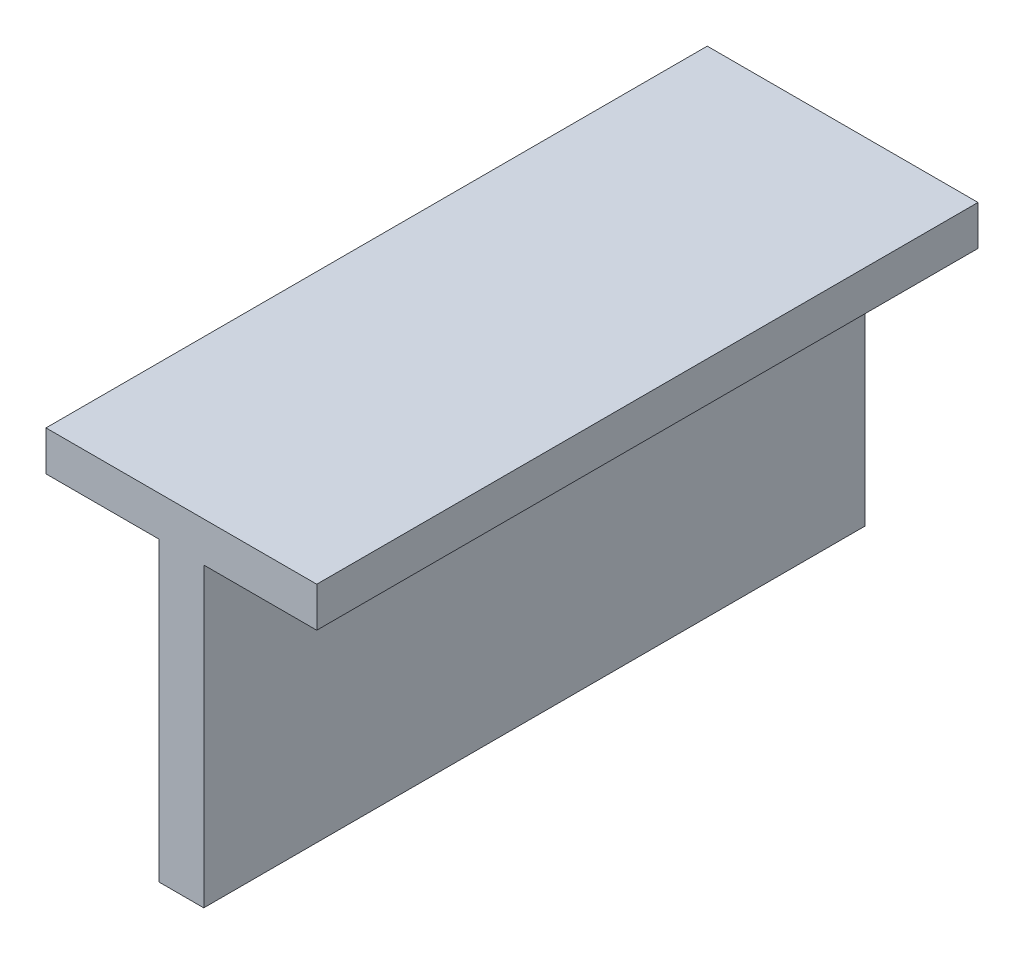
ISO-10303-21;
HEADER;
FILE_DESCRIPTION(('STEP AP214'),'2;1');
FILE_NAME('part.step','',(''),(''),'','','');
FILE_SCHEMA(('AUTOMOTIVE_DESIGN { 1 0 10303 214 1 1 1 1 }'));
ENDSEC;
DATA;
#1=APPLICATION_CONTEXT('core data for automotive mechanical design processes');
#2=APPLICATION_PROTOCOL_DEFINITION('international standard','automotive_design',2000,#1);
#3=PRODUCT_CONTEXT('',#1,'mechanical');
#4=PRODUCT('Part','Part','',(#3));
#5=PRODUCT_RELATED_PRODUCT_CATEGORY('part','',(#4));
#6=PRODUCT_DEFINITION_FORMATION('','',#4);
#7=PRODUCT_DEFINITION_CONTEXT('part definition',#1,'design');
#8=PRODUCT_DEFINITION('design','',#6,#7);
#9=PRODUCT_DEFINITION_SHAPE('','',#8);
#10=(LENGTH_UNIT() NAMED_UNIT(*) SI_UNIT(.MILLI.,.METRE.));
#11=(NAMED_UNIT(*) PLANE_ANGLE_UNIT() SI_UNIT($,.RADIAN.));
#12=(NAMED_UNIT(*) SI_UNIT($,.STERADIAN.) SOLID_ANGLE_UNIT());
#13=UNCERTAINTY_MEASURE_WITH_UNIT(LENGTH_MEASURE(1.E-05),#10,'distance_accuracy_value','');
#14=(GEOMETRIC_REPRESENTATION_CONTEXT(3) GLOBAL_UNCERTAINTY_ASSIGNED_CONTEXT((#13)) GLOBAL_UNIT_ASSIGNED_CONTEXT((#10,
#11,#12)) REPRESENTATION_CONTEXT('',''));
#15=CARTESIAN_POINT('',(0.,0.,0.));
#16=DIRECTION('',(0.,0.,1.));
#17=DIRECTION('',(1.,0.,0.));
#18=AXIS2_PLACEMENT_3D('',#15,#16,#17);
#19=CARTESIAN_POINT('',(-2.14884720015,-1.86097778162,0.));
#20=DIRECTION('',(0.,-1.,0.));
#21=DIRECTION('',(1.,0.,0.));
#22=AXIS2_PLACEMENT_3D('',#19,#20,#21);
#23=PLANE('',#22);
#24=DIRECTION('',(-1.,0.,0.));
#25=VECTOR('',#24,1.);
#26=CARTESIAN_POINT('',(-2.131758627799,-1.86097778162,0.));
#27=LINE('',#26,#25);
#28=CARTESIAN_POINT('',(-2.131758627799,-1.86097778162,0.));
#29=VERTEX_POINT('',#28);
#30=CARTESIAN_POINT('',(-2.14884720015,-1.86097778162,0.));
#31=VERTEX_POINT('',#30);
#32=EDGE_CURVE('E11',#29,#31,#27,.T.);
#33=ORIENTED_EDGE('',*,*,#32,.F.);
#34=DIRECTION('',(0.,0.,1.));
#35=VECTOR('',#34,1.);
#36=CARTESIAN_POINT('',(-2.131758627799,-1.86097778162,0.));
#37=LINE('',#36,#35);
#38=CARTESIAN_POINT('',(-2.131758627799,-1.86097778162,0.1));
#39=VERTEX_POINT('',#38);
#40=EDGE_CURVE('E24',#29,#39,#37,.T.);
#41=ORIENTED_EDGE('',*,*,#40,.T.);
#42=DIRECTION('',(1.,0.,0.));
#43=VECTOR('',#42,1.);
#44=CARTESIAN_POINT('',(-2.131758627799,-1.86097778162,0.1));
#45=LINE('',#44,#43);
#46=CARTESIAN_POINT('',(-2.14884720015,-1.86097778162,0.1));
#47=VERTEX_POINT('',#46);
#48=EDGE_CURVE('E100',#47,#39,#45,.T.);
#49=ORIENTED_EDGE('',*,*,#48,.F.);
#50=DIRECTION('',(0.,0.,1.));
#51=VECTOR('',#50,1.);
#52=CARTESIAN_POINT('',(-2.14884720015,-1.86097778162,0.));
#53=LINE('',#52,#51);
#54=EDGE_CURVE('E141',#31,#47,#53,.T.);
#55=ORIENTED_EDGE('',*,*,#54,.F.);
#56=EDGE_LOOP('',(#33,#41,#49,#55));
#57=FACE_BOUND('',#56,.T.);
#58=ADVANCED_FACE('F17',(#57),#23,.T.);
#59=CARTESIAN_POINT('',(-2.14884720015,-1.854951376877,0.));
#60=DIRECTION('',(-1.,0.,0.));
#61=DIRECTION('',(0.,-1.,0.));
#62=AXIS2_PLACEMENT_3D('',#59,#60,#61);
#63=PLANE('',#62);
#64=DIRECTION('',(0.,1.,0.));
#65=VECTOR('',#64,1.);
#66=CARTESIAN_POINT('',(-2.14884720015,-1.86097778162,0.));
#67=LINE('',#66,#65);
#68=CARTESIAN_POINT('',(-2.14884720015,-1.854951376877,0.));
#69=VERTEX_POINT('',#68);
#70=EDGE_CURVE('E139',#31,#69,#67,.T.);
#71=ORIENTED_EDGE('',*,*,#70,.F.);
#72=ORIENTED_EDGE('',*,*,#54,.T.);
#73=DIRECTION('',(0.,-1.,0.));
#74=VECTOR('',#73,1.);
#75=CARTESIAN_POINT('',(-2.14884720015,-1.86097778162,0.1));
#76=LINE('',#75,#74);
#77=CARTESIAN_POINT('',(-2.14884720015,-1.854951376877,0.1));
#78=VERTEX_POINT('',#77);
#79=EDGE_CURVE('E137',#78,#47,#76,.T.);
#80=ORIENTED_EDGE('',*,*,#79,.F.);
#81=DIRECTION('',(0.,0.,1.));
#82=VECTOR('',#81,1.);
#83=CARTESIAN_POINT('',(-2.14884720015,-1.854951376877,0.));
#84=LINE('',#83,#82);
#85=EDGE_CURVE('E134',#69,#78,#84,.T.);
#86=ORIENTED_EDGE('',*,*,#85,.F.);
#87=EDGE_LOOP('',(#71,#72,#80,#86));
#88=FACE_BOUND('',#87,.T.);
#89=ADVANCED_FACE('F163',(#88),#63,.T.);
#90=CARTESIAN_POINT('',(-2.107900669299,-1.854951376877,0.));
#91=DIRECTION('',(0.,1.,0.));
#92=DIRECTION('',(-1.,0.,0.));
#93=AXIS2_PLACEMENT_3D('',#90,#91,#92);
#94=PLANE('',#93);
#95=DIRECTION('',(1.,0.,0.));
#96=VECTOR('',#95,1.);
#97=CARTESIAN_POINT('',(-2.14884720015,-1.854951376877,0.));
#98=LINE('',#97,#96);
#99=CARTESIAN_POINT('',(-2.107900669299,-1.854951376877,0.));
#100=VERTEX_POINT('',#99);
#101=EDGE_CURVE('E132',#69,#100,#98,.T.);
#102=ORIENTED_EDGE('',*,*,#101,.F.);
#103=ORIENTED_EDGE('',*,*,#85,.T.);
#104=DIRECTION('',(-1.,0.,0.));
#105=VECTOR('',#104,1.);
#106=CARTESIAN_POINT('',(-2.14884720015,-1.854951376877,0.1));
#107=LINE('',#106,#105);
#108=CARTESIAN_POINT('',(-2.107900669299,-1.854951376877,0.1));
#109=VERTEX_POINT('',#108);
#110=EDGE_CURVE('E129',#109,#78,#107,.T.);
#111=ORIENTED_EDGE('',*,*,#110,.F.);
#112=DIRECTION('',(0.,0.,1.));
#113=VECTOR('',#112,1.);
#114=CARTESIAN_POINT('',(-2.107900669299,-1.854951376877,0.));
#115=LINE('',#114,#113);
#116=EDGE_CURVE('E126',#100,#109,#115,.T.);
#117=ORIENTED_EDGE('',*,*,#116,.F.);
#118=EDGE_LOOP('',(#102,#103,#111,#117));
#119=FACE_BOUND('',#118,.T.);
#120=ADVANCED_FACE('F159',(#119),#94,.T.);
#121=CARTESIAN_POINT('',(-2.107900669299,-1.86097778162,0.));
#122=DIRECTION('',(1.,0.,0.));
#123=DIRECTION('',(0.,1.,0.));
#124=AXIS2_PLACEMENT_3D('',#121,#122,#123);
#125=PLANE('',#124);
#126=DIRECTION('',(0.,-1.,0.));
#127=VECTOR('',#126,1.);
#128=CARTESIAN_POINT('',(-2.107900669299,-1.854951376877,0.));
#129=LINE('',#128,#127);
#130=CARTESIAN_POINT('',(-2.107900669299,-1.86097778162,0.));
#131=VERTEX_POINT('',#130);
#132=EDGE_CURVE('E124',#100,#131,#129,.T.);
#133=ORIENTED_EDGE('',*,*,#132,.F.);
#134=ORIENTED_EDGE('',*,*,#116,.T.);
#135=DIRECTION('',(0.,1.,0.));
#136=VECTOR('',#135,1.);
#137=CARTESIAN_POINT('',(-2.107900669299,-1.854951376877,0.1));
#138=LINE('',#137,#136);
#139=CARTESIAN_POINT('',(-2.107900669299,-1.86097778162,0.1));
#140=VERTEX_POINT('',#139);
#141=EDGE_CURVE('E121',#140,#109,#138,.T.);
#142=ORIENTED_EDGE('',*,*,#141,.F.);
#143=DIRECTION('',(0.,0.,1.));
#144=VECTOR('',#143,1.);
#145=CARTESIAN_POINT('',(-2.107900669299,-1.86097778162,0.));
#146=LINE('',#145,#144);
#147=EDGE_CURVE('E118',#131,#140,#146,.T.);
#148=ORIENTED_EDGE('',*,*,#147,.F.);
#149=EDGE_LOOP('',(#133,#134,#142,#148));
#150=FACE_BOUND('',#149,.T.);
#151=ADVANCED_FACE('F155',(#150),#125,.T.);
#152=CARTESIAN_POINT('',(-2.12498924165,-1.86097778162,0.));
#153=DIRECTION('',(0.,-1.,0.));
#154=DIRECTION('',(1.,0.,0.));
#155=AXIS2_PLACEMENT_3D('',#152,#153,#154);
#156=PLANE('',#155);
#157=DIRECTION('',(-1.,0.,0.));
#158=VECTOR('',#157,1.);
#159=CARTESIAN_POINT('',(-2.107900669299,-1.86097778162,0.));
#160=LINE('',#159,#158);
#161=CARTESIAN_POINT('',(-2.12498924165,-1.86097778162,0.));
#162=VERTEX_POINT('',#161);
#163=EDGE_CURVE('E116',#131,#162,#160,.T.);
#164=ORIENTED_EDGE('',*,*,#163,.F.);
#165=ORIENTED_EDGE('',*,*,#147,.T.);
#166=DIRECTION('',(1.,0.,0.));
#167=VECTOR('',#166,1.);
#168=CARTESIAN_POINT('',(-2.107900669299,-1.86097778162,0.1));
#169=LINE('',#168,#167);
#170=CARTESIAN_POINT('',(-2.12498924165,-1.86097778162,0.1));
#171=VERTEX_POINT('',#170);
#172=EDGE_CURVE('E113',#171,#140,#169,.T.);
#173=ORIENTED_EDGE('',*,*,#172,.F.);
#174=DIRECTION('',(0.,0.,1.));
#175=VECTOR('',#174,1.);
#176=CARTESIAN_POINT('',(-2.12498924165,-1.86097778162,0.));
#177=LINE('',#176,#175);
#178=EDGE_CURVE('E110',#162,#171,#177,.T.);
#179=ORIENTED_EDGE('',*,*,#178,.F.);
#180=EDGE_LOOP('',(#164,#165,#173,#179));
#181=FACE_BOUND('',#180,.T.);
#182=ADVANCED_FACE('F151',(#181),#156,.T.);
#183=CARTESIAN_POINT('',(-2.12498924165,-1.905886879973,0.));
#184=DIRECTION('',(1.,0.,0.));
#185=DIRECTION('',(0.,1.,0.));
#186=AXIS2_PLACEMENT_3D('',#183,#184,#185);
#187=PLANE('',#186);
#188=DIRECTION('',(0.,-1.,0.));
#189=VECTOR('',#188,1.);
#190=CARTESIAN_POINT('',(-2.12498924165,-1.86097778162,0.));
#191=LINE('',#190,#189);
#192=CARTESIAN_POINT('',(-2.12498924165,-1.905886879973,0.));
#193=VERTEX_POINT('',#192);
#194=EDGE_CURVE('E108',#162,#193,#191,.T.);
#195=ORIENTED_EDGE('',*,*,#194,.F.);
#196=ORIENTED_EDGE('',*,*,#178,.T.);
#197=DIRECTION('',(0.,1.,0.));
#198=VECTOR('',#197,1.);
#199=CARTESIAN_POINT('',(-2.12498924165,-1.86097778162,0.1));
#200=LINE('',#199,#198);
#201=CARTESIAN_POINT('',(-2.12498924165,-1.905886879973,0.1));
#202=VERTEX_POINT('',#201);
#203=EDGE_CURVE('E106',#202,#171,#200,.T.);
#204=ORIENTED_EDGE('',*,*,#203,.F.);
#205=DIRECTION('',(0.,0.,1.));
#206=VECTOR('',#205,1.);
#207=CARTESIAN_POINT('',(-2.12498924165,-1.905886879973,0.));
#208=LINE('',#207,#206);
#209=EDGE_CURVE('E85',#193,#202,#208,.T.);
#210=ORIENTED_EDGE('',*,*,#209,.F.);
#211=EDGE_LOOP('',(#195,#196,#204,#210));
#212=FACE_BOUND('',#211,.T.);
#213=ADVANCED_FACE('F149',(#212),#187,.T.);
#214=CARTESIAN_POINT('',(-2.131758627799,-1.905886879973,0.));
#215=DIRECTION('',(0.,-1.,0.));
#216=DIRECTION('',(1.,0.,0.));
#217=AXIS2_PLACEMENT_3D('',#214,#215,#216);
#218=PLANE('',#217);
#219=DIRECTION('',(-1.,0.,0.));
#220=VECTOR('',#219,1.);
#221=CARTESIAN_POINT('',(-2.12498924165,-1.905886879973,0.));
#222=LINE('',#221,#220);
#223=CARTESIAN_POINT('',(-2.131758627799,-1.905886879973,0.));
#224=VERTEX_POINT('',#223);
#225=EDGE_CURVE('E89',#193,#224,#222,.T.);
#226=ORIENTED_EDGE('',*,*,#225,.F.);
#227=ORIENTED_EDGE('',*,*,#209,.T.);
#228=DIRECTION('',(1.,0.,0.));
#229=VECTOR('',#228,1.);
#230=CARTESIAN_POINT('',(-2.12498924165,-1.905886879973,0.1));
#231=LINE('',#230,#229);
#232=CARTESIAN_POINT('',(-2.131758627799,-1.905886879973,0.1));
#233=VERTEX_POINT('',#232);
#234=EDGE_CURVE('E78',#233,#202,#231,.T.);
#235=ORIENTED_EDGE('',*,*,#234,.F.);
#236=DIRECTION('',(0.,0.,1.));
#237=VECTOR('',#236,1.);
#238=CARTESIAN_POINT('',(-2.131758627799,-1.905886879973,0.));
#239=LINE('',#238,#237);
#240=EDGE_CURVE('E82',#224,#233,#239,.T.);
#241=ORIENTED_EDGE('',*,*,#240,.F.);
#242=EDGE_LOOP('',(#226,#227,#235,#241));
#243=FACE_BOUND('',#242,.T.);
#244=ADVANCED_FACE('F81',(#243),#218,.T.);
#245=CARTESIAN_POINT('',(-2.131758627799,-1.86097778162,0.));
#246=DIRECTION('',(-1.,0.,0.));
#247=DIRECTION('',(0.,-1.,0.));
#248=AXIS2_PLACEMENT_3D('',#245,#246,#247);
#249=PLANE('',#248);
#250=DIRECTION('',(0.,1.,0.));
#251=VECTOR('',#250,1.);
#252=CARTESIAN_POINT('',(-2.131758627799,-1.905886879973,0.));
#253=LINE('',#252,#251);
#254=EDGE_CURVE('E95',#224,#29,#253,.T.);
#255=ORIENTED_EDGE('',*,*,#254,.F.);
#256=ORIENTED_EDGE('',*,*,#240,.T.);
#257=DIRECTION('',(0.,-1.,0.));
#258=VECTOR('',#257,1.);
#259=CARTESIAN_POINT('',(-2.131758627799,-1.905886879973,0.1));
#260=LINE('',#259,#258);
#261=EDGE_CURVE('E94',#39,#233,#260,.T.);
#262=ORIENTED_EDGE('',*,*,#261,.F.);
#263=ORIENTED_EDGE('',*,*,#40,.F.);
#264=EDGE_LOOP('',(#255,#256,#262,#263));
#265=FACE_BOUND('',#264,.T.);
#266=ADVANCED_FACE('F93',(#265),#249,.T.);
#267=CARTESIAN_POINT('',(-2.128373934724,-1.872066762424,0.));
#268=DIRECTION('',(0.,0.,1.));
#269=DIRECTION('',(1.,0.,0.));
#270=AXIS2_PLACEMENT_3D('',#267,#268,#269);
#271=PLANE('',#270);
#272=ORIENTED_EDGE('',*,*,#254,.T.);
#273=ORIENTED_EDGE('',*,*,#32,.T.);
#274=ORIENTED_EDGE('',*,*,#70,.T.);
#275=ORIENTED_EDGE('',*,*,#101,.T.);
#276=ORIENTED_EDGE('',*,*,#132,.T.);
#277=ORIENTED_EDGE('',*,*,#163,.T.);
#278=ORIENTED_EDGE('',*,*,#194,.T.);
#279=ORIENTED_EDGE('',*,*,#225,.T.);
#280=EDGE_LOOP('',(#272,#273,#274,#275,#276,#277,#278,#279));
#281=FACE_BOUND('',#280,.T.);
#282=ADVANCED_FACE('F144',(#281),#271,.F.);
#283=CARTESIAN_POINT('',(-2.128373934724,-1.872066762424,0.1));
#284=DIRECTION('',(0.,0.,1.));
#285=DIRECTION('',(1.,0.,0.));
#286=AXIS2_PLACEMENT_3D('',#283,#284,#285);
#287=PLANE('',#286);
#288=ORIENTED_EDGE('',*,*,#261,.T.);
#289=ORIENTED_EDGE('',*,*,#234,.T.);
#290=ORIENTED_EDGE('',*,*,#203,.T.);
#291=ORIENTED_EDGE('',*,*,#172,.T.);
#292=ORIENTED_EDGE('',*,*,#141,.T.);
#293=ORIENTED_EDGE('',*,*,#110,.T.);
#294=ORIENTED_EDGE('',*,*,#79,.T.);
#295=ORIENTED_EDGE('',*,*,#48,.T.);
#296=EDGE_LOOP('',(#288,#289,#290,#291,#292,#293,#294,#295));
#297=FACE_BOUND('',#296,.T.);
#298=ADVANCED_FACE('F98',(#297),#287,.T.);
#299=CLOSED_SHELL('',(#58,#89,#120,#151,#182,#213,#244,#266,#282,#298));
#300=MANIFOLD_SOLID_BREP('B1',#299);
#301=ADVANCED_BREP_SHAPE_REPRESENTATION('',(#18,#300),#14);
#302=SHAPE_DEFINITION_REPRESENTATION(#9,#301);
ENDSEC;
END-ISO-10303-21;
